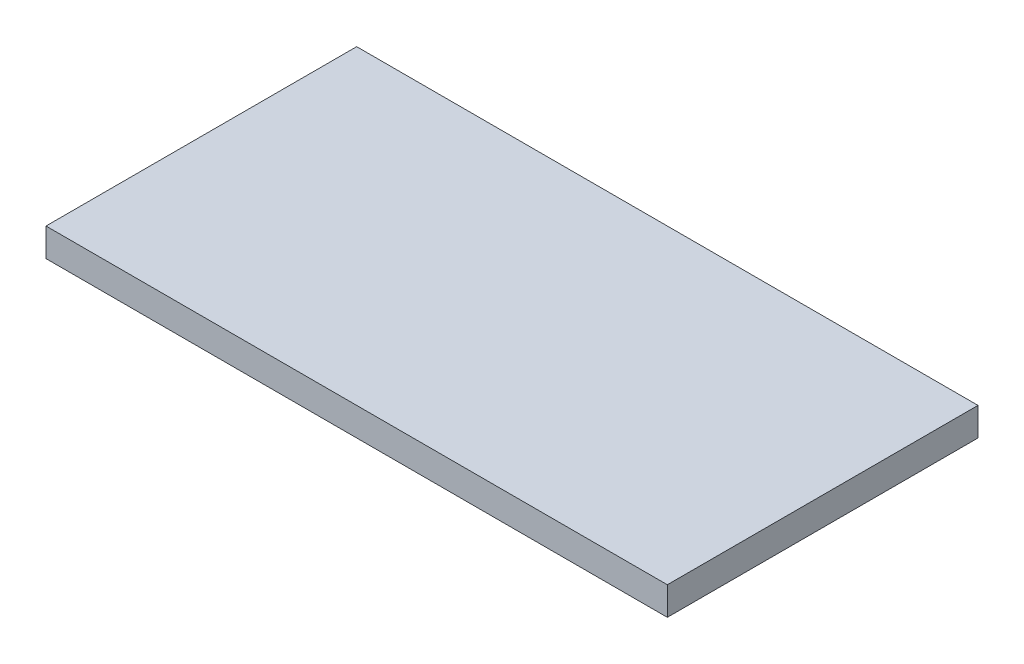
ISO-10303-21;
HEADER;
FILE_DESCRIPTION(('STEP AP214'),'2;1');
FILE_NAME('part.step','',(''),(''),'','','');
FILE_SCHEMA(('AUTOMOTIVE_DESIGN { 1 0 10303 214 1 1 1 1 }'));
ENDSEC;
DATA;
#1=APPLICATION_CONTEXT('core data for automotive mechanical design processes');
#2=APPLICATION_PROTOCOL_DEFINITION('international standard','automotive_design',2000,#1);
#3=PRODUCT_CONTEXT('',#1,'mechanical');
#4=PRODUCT('Part','Part','',(#3));
#5=PRODUCT_RELATED_PRODUCT_CATEGORY('part','',(#4));
#6=PRODUCT_DEFINITION_FORMATION('','',#4);
#7=PRODUCT_DEFINITION_CONTEXT('part definition',#1,'design');
#8=PRODUCT_DEFINITION('design','',#6,#7);
#9=PRODUCT_DEFINITION_SHAPE('','',#8);
#10=(LENGTH_UNIT() NAMED_UNIT(*) SI_UNIT(.MILLI.,.METRE.));
#11=(NAMED_UNIT(*) PLANE_ANGLE_UNIT() SI_UNIT($,.RADIAN.));
#12=(NAMED_UNIT(*) SI_UNIT($,.STERADIAN.) SOLID_ANGLE_UNIT());
#13=UNCERTAINTY_MEASURE_WITH_UNIT(LENGTH_MEASURE(1.E-05),#10,'distance_accuracy_value','');
#14=(GEOMETRIC_REPRESENTATION_CONTEXT(3) GLOBAL_UNCERTAINTY_ASSIGNED_CONTEXT((#13)) GLOBAL_UNIT_ASSIGNED_CONTEXT((#10,
#11,#12)) REPRESENTATION_CONTEXT('',''));
#15=CARTESIAN_POINT('',(0.,0.,0.));
#16=DIRECTION('',(0.,0.,1.));
#17=DIRECTION('',(1.,0.,0.));
#18=AXIS2_PLACEMENT_3D('',#15,#16,#17);
#19=CARTESIAN_POINT('',(0.,1.,0.));
#20=DIRECTION('',(1.,0.,0.));
#21=DIRECTION('',(0.,0.,-1.));
#22=AXIS2_PLACEMENT_3D('',#19,#20,#21);
#23=PLANE('',#22);
#24=DIRECTION('',(0.,0.,1.));
#25=VECTOR('',#24,1.);
#26=CARTESIAN_POINT('',(0.,0.,0.));
#27=LINE('',#26,#25);
#28=CARTESIAN_POINT('',(0.,0.,0.));
#29=VERTEX_POINT('',#28);
#30=CARTESIAN_POINT('',(0.,0.,11.));
#31=VERTEX_POINT('',#30);
#32=EDGE_CURVE('E95',#29,#31,#27,.T.);
#33=ORIENTED_EDGE('',*,*,#32,.T.);
#34=DIRECTION('',(0.,-1.,0.));
#35=VECTOR('',#34,1.);
#36=CARTESIAN_POINT('',(0.,1.,11.));
#37=LINE('',#36,#35);
#38=CARTESIAN_POINT('',(0.,1.,11.));
#39=VERTEX_POINT('',#38);
#40=EDGE_CURVE('E11',#39,#31,#37,.T.);
#41=ORIENTED_EDGE('',*,*,#40,.F.);
#42=DIRECTION('',(0.,0.,1.));
#43=VECTOR('',#42,1.);
#44=CARTESIAN_POINT('',(0.,1.,0.));
#45=LINE('',#44,#43);
#46=CARTESIAN_POINT('',(0.,1.,0.));
#47=VERTEX_POINT('',#46);
#48=EDGE_CURVE('E83',#47,#39,#45,.T.);
#49=ORIENTED_EDGE('',*,*,#48,.F.);
#50=DIRECTION('',(0.,-1.,0.));
#51=VECTOR('',#50,1.);
#52=CARTESIAN_POINT('',(0.,1.,0.));
#53=LINE('',#52,#51);
#54=EDGE_CURVE('E91',#47,#29,#53,.T.);
#55=ORIENTED_EDGE('',*,*,#54,.T.);
#56=EDGE_LOOP('',(#33,#41,#49,#55));
#57=FACE_BOUND('',#56,.T.);
#58=ADVANCED_FACE('F32',(#57),#23,.F.);
#59=CARTESIAN_POINT('',(0.,1.,11.));
#60=DIRECTION('',(0.,0.,-1.));
#61=DIRECTION('',(-1.,0.,0.));
#62=AXIS2_PLACEMENT_3D('',#59,#60,#61);
#63=PLANE('',#62);
#64=DIRECTION('',(1.,0.,0.));
#65=VECTOR('',#64,1.);
#66=CARTESIAN_POINT('',(0.,0.,11.));
#67=LINE('',#66,#65);
#68=CARTESIAN_POINT('',(22.,0.,11.));
#69=VERTEX_POINT('',#68);
#70=EDGE_CURVE('E87',#31,#69,#67,.T.);
#71=ORIENTED_EDGE('',*,*,#70,.T.);
#72=DIRECTION('',(0.,-1.,0.));
#73=VECTOR('',#72,1.);
#74=CARTESIAN_POINT('',(22.,1.,11.));
#75=LINE('',#74,#73);
#76=CARTESIAN_POINT('',(22.,1.,11.));
#77=VERTEX_POINT('',#76);
#78=EDGE_CURVE('E40',#77,#69,#75,.T.);
#79=ORIENTED_EDGE('',*,*,#78,.F.);
#80=DIRECTION('',(1.,0.,0.));
#81=VECTOR('',#80,1.);
#82=CARTESIAN_POINT('',(0.,1.,11.));
#83=LINE('',#82,#81);
#84=EDGE_CURVE('E78',#39,#77,#83,.T.);
#85=ORIENTED_EDGE('',*,*,#84,.F.);
#86=ORIENTED_EDGE('',*,*,#40,.T.);
#87=EDGE_LOOP('',(#71,#79,#85,#86));
#88=FACE_BOUND('',#87,.T.);
#89=ADVANCED_FACE('F86',(#88),#63,.F.);
#90=CARTESIAN_POINT('',(22.,1.,0.));
#91=DIRECTION('',(-1.,0.,0.));
#92=DIRECTION('',(0.,0.,1.));
#93=AXIS2_PLACEMENT_3D('',#90,#91,#92);
#94=PLANE('',#93);
#95=DIRECTION('',(0.,0.,-1.));
#96=VECTOR('',#95,1.);
#97=CARTESIAN_POINT('',(22.,0.,0.));
#98=LINE('',#97,#96);
#99=CARTESIAN_POINT('',(22.,0.,0.));
#100=VERTEX_POINT('',#99);
#101=EDGE_CURVE('E65',#69,#100,#98,.T.);
#102=ORIENTED_EDGE('',*,*,#101,.T.);
#103=DIRECTION('',(0.,-1.,0.));
#104=VECTOR('',#103,1.);
#105=CARTESIAN_POINT('',(22.,1.,0.));
#106=LINE('',#105,#104);
#107=CARTESIAN_POINT('',(22.,1.,0.));
#108=VERTEX_POINT('',#107);
#109=EDGE_CURVE('E88',#108,#100,#106,.T.);
#110=ORIENTED_EDGE('',*,*,#109,.F.);
#111=DIRECTION('',(0.,0.,-1.));
#112=VECTOR('',#111,1.);
#113=CARTESIAN_POINT('',(22.,1.,0.));
#114=LINE('',#113,#112);
#115=EDGE_CURVE('E81',#77,#108,#114,.T.);
#116=ORIENTED_EDGE('',*,*,#115,.F.);
#117=ORIENTED_EDGE('',*,*,#78,.T.);
#118=EDGE_LOOP('',(#102,#110,#116,#117));
#119=FACE_BOUND('',#118,.T.);
#120=ADVANCED_FACE('F89',(#119),#94,.F.);
#121=CARTESIAN_POINT('',(0.,1.,0.));
#122=DIRECTION('',(0.,0.,1.));
#123=DIRECTION('',(1.,0.,0.));
#124=AXIS2_PLACEMENT_3D('',#121,#122,#123);
#125=PLANE('',#124);
#126=DIRECTION('',(-1.,0.,0.));
#127=VECTOR('',#126,1.);
#128=CARTESIAN_POINT('',(0.,0.,0.));
#129=LINE('',#128,#127);
#130=EDGE_CURVE('E71',#100,#29,#129,.T.);
#131=ORIENTED_EDGE('',*,*,#130,.T.);
#132=ORIENTED_EDGE('',*,*,#54,.F.);
#133=DIRECTION('',(-1.,0.,0.));
#134=VECTOR('',#133,1.);
#135=CARTESIAN_POINT('',(0.,1.,0.));
#136=LINE('',#135,#134);
#137=EDGE_CURVE('E48',#108,#47,#136,.T.);
#138=ORIENTED_EDGE('',*,*,#137,.F.);
#139=ORIENTED_EDGE('',*,*,#109,.T.);
#140=EDGE_LOOP('',(#131,#132,#138,#139));
#141=FACE_BOUND('',#140,.T.);
#142=ADVANCED_FACE('F102',(#141),#125,.F.);
#143=CARTESIAN_POINT('',(0.,1.,0.));
#144=DIRECTION('',(0.,1.,0.));
#145=DIRECTION('',(0.,0.,1.));
#146=AXIS2_PLACEMENT_3D('',#143,#144,#145);
#147=PLANE('',#146);
#148=ORIENTED_EDGE('',*,*,#48,.T.);
#149=ORIENTED_EDGE('',*,*,#84,.T.);
#150=ORIENTED_EDGE('',*,*,#115,.T.);
#151=ORIENTED_EDGE('',*,*,#137,.T.);
#152=EDGE_LOOP('',(#148,#149,#150,#151));
#153=FACE_BOUND('',#152,.T.);
#154=ADVANCED_FACE('F79',(#153),#147,.T.);
#155=CARTESIAN_POINT('',(0.,0.,0.));
#156=DIRECTION('',(0.,1.,0.));
#157=DIRECTION('',(0.,0.,1.));
#158=AXIS2_PLACEMENT_3D('',#155,#156,#157);
#159=PLANE('',#158);
#160=ORIENTED_EDGE('',*,*,#32,.F.);
#161=ORIENTED_EDGE('',*,*,#130,.F.);
#162=ORIENTED_EDGE('',*,*,#101,.F.);
#163=ORIENTED_EDGE('',*,*,#70,.F.);
#164=EDGE_LOOP('',(#160,#161,#162,#163));
#165=FACE_BOUND('',#164,.T.);
#166=ADVANCED_FACE('F105',(#165),#159,.F.);
#167=CLOSED_SHELL('',(#58,#89,#120,#142,#154,#166));
#168=MANIFOLD_SOLID_BREP('B2',#167);
#169=ADVANCED_BREP_SHAPE_REPRESENTATION('',(#18,#168),#14);
#170=SHAPE_DEFINITION_REPRESENTATION(#9,#169);
ENDSEC;
END-ISO-10303-21;
